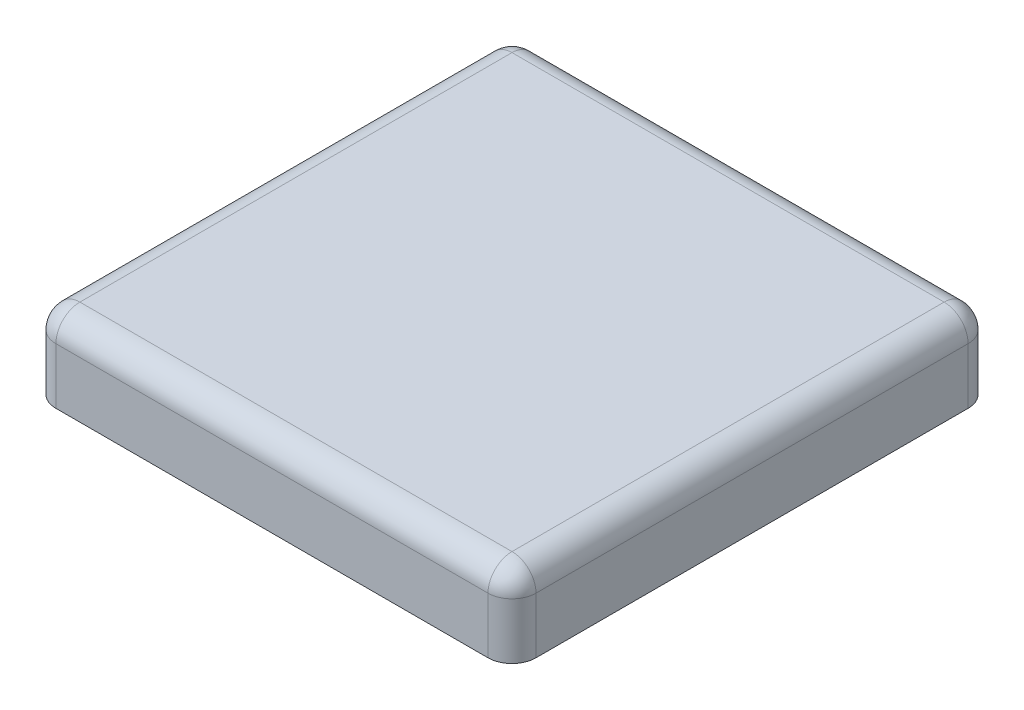
ISO-10303-21;
HEADER;
FILE_DESCRIPTION(('STEP AP214'),'2;1');
FILE_NAME('part.step','',(''),(''),'','','');
FILE_SCHEMA(('AUTOMOTIVE_DESIGN { 1 0 10303 214 1 1 1 1 }'));
ENDSEC;
DATA;
#1=APPLICATION_CONTEXT('core data for automotive mechanical design processes');
#2=APPLICATION_PROTOCOL_DEFINITION('international standard','automotive_design',2000,#1);
#3=PRODUCT_CONTEXT('',#1,'mechanical');
#4=PRODUCT('Part','Part','',(#3));
#5=PRODUCT_RELATED_PRODUCT_CATEGORY('part','',(#4));
#6=PRODUCT_DEFINITION_FORMATION('','',#4);
#7=PRODUCT_DEFINITION_CONTEXT('part definition',#1,'design');
#8=PRODUCT_DEFINITION('design','',#6,#7);
#9=PRODUCT_DEFINITION_SHAPE('','',#8);
#10=(LENGTH_UNIT() NAMED_UNIT(*) SI_UNIT(.MILLI.,.METRE.));
#11=(NAMED_UNIT(*) PLANE_ANGLE_UNIT() SI_UNIT($,.RADIAN.));
#12=(NAMED_UNIT(*) SI_UNIT($,.STERADIAN.) SOLID_ANGLE_UNIT());
#13=UNCERTAINTY_MEASURE_WITH_UNIT(LENGTH_MEASURE(1.E-05),#10,'distance_accuracy_value','');
#14=(GEOMETRIC_REPRESENTATION_CONTEXT(3) GLOBAL_UNCERTAINTY_ASSIGNED_CONTEXT((#13)) GLOBAL_UNIT_ASSIGNED_CONTEXT((#10,
#11,#12)) REPRESENTATION_CONTEXT('',''));
#15=CARTESIAN_POINT('',(0.,0.,0.));
#16=DIRECTION('',(0.,0.,1.));
#17=DIRECTION('',(1.,0.,0.));
#18=AXIS2_PLACEMENT_3D('',#15,#16,#17);
#19=CARTESIAN_POINT('',(0.,171.866203650905,0.));
#20=DIRECTION('',(0.,-1.,0.));
#21=DIRECTION('',(0.,0.,-1.));
#22=AXIS2_PLACEMENT_3D('',#19,#20,#21);
#23=PLANE('',#22);
#24=DIRECTION('',(-1.,0.,0.));
#25=VECTOR('',#24,1.);
#26=CARTESIAN_POINT('',(-15.2400000000001,171.866203650905,-15.24));
#27=LINE('',#26,#25);
#28=CARTESIAN_POINT('',(13.7159999999999,171.866203650905,-15.24));
#29=VERTEX_POINT('',#28);
#30=CARTESIAN_POINT('',(-13.7160000000001,171.866203650905,-15.24));
#31=VERTEX_POINT('',#30);
#32=EDGE_CURVE('E196',#29,#31,#27,.T.);
#33=ORIENTED_EDGE('',*,*,#32,.F.);
#34=CARTESIAN_POINT('',(13.7159999999999,171.866203650905,-13.716));
#35=DIRECTION('',(0.,-1.,0.));
#36=DIRECTION('',(0.,0.,-1.));
#37=AXIS2_PLACEMENT_3D('',#34,#35,#36);
#38=CIRCLE('',#37,1.524);
#39=CARTESIAN_POINT('',(15.2399999999999,171.866203650905,-13.716));
#40=VERTEX_POINT('',#39);
#41=EDGE_CURVE('E11',#29,#40,#38,.T.);
#42=ORIENTED_EDGE('',*,*,#41,.T.);
#43=DIRECTION('',(0.,0.,-1.));
#44=VECTOR('',#43,1.);
#45=CARTESIAN_POINT('',(15.2399999999999,171.866203650905,15.24));
#46=LINE('',#45,#44);
#47=CARTESIAN_POINT('',(15.2399999999999,171.866203650905,13.716));
#48=VERTEX_POINT('',#47);
#49=EDGE_CURVE('E193',#48,#40,#46,.T.);
#50=ORIENTED_EDGE('',*,*,#49,.F.);
#51=CARTESIAN_POINT('',(13.7159999999999,171.866203650905,13.716));
#52=DIRECTION('',(0.,-1.,0.));
#53=DIRECTION('',(0.,0.,-1.));
#54=AXIS2_PLACEMENT_3D('',#51,#52,#53);
#55=CIRCLE('',#54,1.524);
#56=CARTESIAN_POINT('',(13.7159999999999,171.866203650905,15.24));
#57=VERTEX_POINT('',#56);
#58=EDGE_CURVE('E257',#48,#57,#55,.T.);
#59=ORIENTED_EDGE('',*,*,#58,.T.);
#60=DIRECTION('',(1.,0.,0.));
#61=VECTOR('',#60,1.);
#62=CARTESIAN_POINT('',(-15.2400000000001,171.866203650905,15.24));
#63=LINE('',#62,#61);
#64=CARTESIAN_POINT('',(-13.7160000000001,171.866203650905,15.24));
#65=VERTEX_POINT('',#64);
#66=EDGE_CURVE('E204',#65,#57,#63,.T.);
#67=ORIENTED_EDGE('',*,*,#66,.F.);
#68=CARTESIAN_POINT('',(-13.7160000000001,171.866203650905,13.716));
#69=DIRECTION('',(0.,-1.,0.));
#70=DIRECTION('',(0.,0.,-1.));
#71=AXIS2_PLACEMENT_3D('',#68,#69,#70);
#72=CIRCLE('',#71,1.524);
#73=CARTESIAN_POINT('',(-15.2400000000001,171.866203650905,13.716));
#74=VERTEX_POINT('',#73);
#75=EDGE_CURVE('E260',#65,#74,#72,.T.);
#76=ORIENTED_EDGE('',*,*,#75,.T.);
#77=DIRECTION('',(0.,0.,1.));
#78=VECTOR('',#77,1.);
#79=CARTESIAN_POINT('',(-15.2400000000001,171.866203650905,15.24));
#80=LINE('',#79,#78);
#81=CARTESIAN_POINT('',(-15.2400000000001,171.866203650905,-13.716));
#82=VERTEX_POINT('',#81);
#83=EDGE_CURVE('E200',#82,#74,#80,.T.);
#84=ORIENTED_EDGE('',*,*,#83,.F.);
#85=CARTESIAN_POINT('',(-13.7160000000001,171.866203650905,-13.716));
#86=DIRECTION('',(0.,-1.,0.));
#87=DIRECTION('',(0.,0.,-1.));
#88=AXIS2_PLACEMENT_3D('',#85,#86,#87);
#89=CIRCLE('',#88,1.524);
#90=EDGE_CURVE('E48',#82,#31,#89,.T.);
#91=ORIENTED_EDGE('',*,*,#90,.T.);
#92=EDGE_LOOP('',(#33,#42,#50,#59,#67,#76,#84,#91));
#93=FACE_BOUND('',#92,.T.);
#94=DIRECTION('',(0.,0.,-1.));
#95=VECTOR('',#94,1.);
#96=CARTESIAN_POINT('',(13.7159999999999,171.866203650905,0.));
#97=LINE('',#96,#95);
#98=CARTESIAN_POINT('',(13.7159999999999,171.866203650905,13.716));
#99=VERTEX_POINT('',#98);
#100=CARTESIAN_POINT('',(13.7159999999999,171.866203650905,-13.716));
#101=VERTEX_POINT('',#100);
#102=EDGE_CURVE('E182',#99,#101,#97,.T.);
#103=ORIENTED_EDGE('',*,*,#102,.T.);
#104=DIRECTION('',(-1.,0.,0.));
#105=VECTOR('',#104,1.);
#106=CARTESIAN_POINT('',(0.,171.866203650905,-13.716));
#107=LINE('',#106,#105);
#108=CARTESIAN_POINT('',(-13.7160000000001,171.866203650905,-13.716));
#109=VERTEX_POINT('',#108);
#110=EDGE_CURVE('E149',#101,#109,#107,.T.);
#111=ORIENTED_EDGE('',*,*,#110,.T.);
#112=DIRECTION('',(0.,0.,1.));
#113=VECTOR('',#112,1.);
#114=CARTESIAN_POINT('',(-13.7160000000001,171.866203650905,0.));
#115=LINE('',#114,#113);
#116=CARTESIAN_POINT('',(-13.7160000000001,171.866203650905,13.716));
#117=VERTEX_POINT('',#116);
#118=EDGE_CURVE('E187',#109,#117,#115,.T.);
#119=ORIENTED_EDGE('',*,*,#118,.T.);
#120=DIRECTION('',(1.,0.,0.));
#121=VECTOR('',#120,1.);
#122=CARTESIAN_POINT('',(0.,171.866203650905,13.716));
#123=LINE('',#122,#121);
#124=EDGE_CURVE('E56',#117,#99,#123,.T.);
#125=ORIENTED_EDGE('',*,*,#124,.T.);
#126=EDGE_LOOP('',(#103,#111,#119,#125));
#127=FACE_BOUND('',#126,.T.);
#128=ADVANCED_FACE('F38',(#93,#127),#23,.T.);
#129=CARTESIAN_POINT('',(15.2399999999999,176.946203650905,15.24));
#130=DIRECTION('',(-1.,0.,0.));
#131=DIRECTION('',(0.,0.,1.));
#132=AXIS2_PLACEMENT_3D('',#129,#130,#131);
#133=PLANE('',#132);
#134=ORIENTED_EDGE('',*,*,#49,.T.);
#135=DIRECTION('',(0.,-1.,0.));
#136=VECTOR('',#135,1.);
#137=CARTESIAN_POINT('',(15.2399999999999,176.946203650905,-13.716));
#138=LINE('',#137,#136);
#139=CARTESIAN_POINT('',(15.2399999999999,175.422203650905,-13.716));
#140=VERTEX_POINT('',#139);
#141=EDGE_CURVE('E64',#40,#140,#138,.F.);
#142=ORIENTED_EDGE('',*,*,#141,.T.);
#143=DIRECTION('',(0.,0.,-1.));
#144=VECTOR('',#143,1.);
#145=CARTESIAN_POINT('',(15.2399999999999,175.422203650905,15.24));
#146=LINE('',#145,#144);
#147=CARTESIAN_POINT('',(15.2399999999999,175.422203650905,13.716));
#148=VERTEX_POINT('',#147);
#149=EDGE_CURVE('E252',#140,#148,#146,.F.);
#150=ORIENTED_EDGE('',*,*,#149,.T.);
#151=DIRECTION('',(0.,-1.,0.));
#152=VECTOR('',#151,1.);
#153=CARTESIAN_POINT('',(15.2399999999999,176.946203650905,13.716));
#154=LINE('',#153,#152);
#155=EDGE_CURVE('E249',#148,#48,#154,.T.);
#156=ORIENTED_EDGE('',*,*,#155,.T.);
#157=EDGE_LOOP('',(#134,#142,#150,#156));
#158=FACE_BOUND('',#157,.T.);
#159=ADVANCED_FACE('F343',(#158),#133,.F.);
#160=CARTESIAN_POINT('',(-15.2400000000001,176.946203650905,-15.24));
#161=DIRECTION('',(0.,0.,1.));
#162=DIRECTION('',(1.,0.,0.));
#163=AXIS2_PLACEMENT_3D('',#160,#161,#162);
#164=PLANE('',#163);
#165=DIRECTION('',(-1.,0.,0.));
#166=VECTOR('',#165,1.);
#167=CARTESIAN_POINT('',(-15.2400000000001,175.422203650905,-15.24));
#168=LINE('',#167,#166);
#169=CARTESIAN_POINT('',(-13.7160000000001,175.422203650905,-15.24));
#170=VERTEX_POINT('',#169);
#171=CARTESIAN_POINT('',(13.7159999999999,175.422203650905,-15.24));
#172=VERTEX_POINT('',#171);
#173=EDGE_CURVE('E243',#170,#172,#168,.F.);
#174=ORIENTED_EDGE('',*,*,#173,.T.);
#175=DIRECTION('',(0.,-1.,0.));
#176=VECTOR('',#175,1.);
#177=CARTESIAN_POINT('',(13.7159999999999,176.946203650905,-15.24));
#178=LINE('',#177,#176);
#179=EDGE_CURVE('E246',#172,#29,#178,.T.);
#180=ORIENTED_EDGE('',*,*,#179,.T.);
#181=ORIENTED_EDGE('',*,*,#32,.T.);
#182=DIRECTION('',(0.,-1.,0.));
#183=VECTOR('',#182,1.);
#184=CARTESIAN_POINT('',(-13.7160000000001,176.946203650905,-15.24));
#185=LINE('',#184,#183);
#186=EDGE_CURVE('E240',#31,#170,#185,.F.);
#187=ORIENTED_EDGE('',*,*,#186,.T.);
#188=EDGE_LOOP('',(#174,#180,#181,#187));
#189=FACE_BOUND('',#188,.T.);
#190=ADVANCED_FACE('F333',(#189),#164,.F.);
#191=CARTESIAN_POINT('',(-15.2400000000001,176.946203650905,15.24));
#192=DIRECTION('',(1.,0.,0.));
#193=DIRECTION('',(0.,0.,-1.));
#194=AXIS2_PLACEMENT_3D('',#191,#192,#193);
#195=PLANE('',#194);
#196=DIRECTION('',(0.,0.,1.));
#197=VECTOR('',#196,1.);
#198=CARTESIAN_POINT('',(-15.2400000000001,175.422203650905,15.24));
#199=LINE('',#198,#197);
#200=CARTESIAN_POINT('',(-15.2400000000001,175.422203650905,13.716));
#201=VERTEX_POINT('',#200);
#202=CARTESIAN_POINT('',(-15.2400000000001,175.422203650905,-13.716));
#203=VERTEX_POINT('',#202);
#204=EDGE_CURVE('E234',#201,#203,#199,.F.);
#205=ORIENTED_EDGE('',*,*,#204,.T.);
#206=DIRECTION('',(0.,-1.,0.));
#207=VECTOR('',#206,1.);
#208=CARTESIAN_POINT('',(-15.2400000000001,176.946203650905,-13.716));
#209=LINE('',#208,#207);
#210=EDGE_CURVE('E237',#203,#82,#209,.T.);
#211=ORIENTED_EDGE('',*,*,#210,.T.);
#212=ORIENTED_EDGE('',*,*,#83,.T.);
#213=DIRECTION('',(0.,-1.,0.));
#214=VECTOR('',#213,1.);
#215=CARTESIAN_POINT('',(-15.2400000000001,176.946203650905,13.716));
#216=LINE('',#215,#214);
#217=EDGE_CURVE('E231',#74,#201,#216,.F.);
#218=ORIENTED_EDGE('',*,*,#217,.T.);
#219=EDGE_LOOP('',(#205,#211,#212,#218));
#220=FACE_BOUND('',#219,.T.);
#221=ADVANCED_FACE('F369',(#220),#195,.F.);
#222=CARTESIAN_POINT('',(-15.2400000000001,176.946203650905,15.24));
#223=DIRECTION('',(0.,0.,-1.));
#224=DIRECTION('',(-1.,0.,0.));
#225=AXIS2_PLACEMENT_3D('',#222,#223,#224);
#226=PLANE('',#225);
#227=DIRECTION('',(1.,0.,0.));
#228=VECTOR('',#227,1.);
#229=CARTESIAN_POINT('',(-15.2400000000001,175.422203650905,15.24));
#230=LINE('',#229,#228);
#231=CARTESIAN_POINT('',(13.7159999999999,175.422203650905,15.24));
#232=VERTEX_POINT('',#231);
#233=CARTESIAN_POINT('',(-13.7160000000001,175.422203650905,15.24));
#234=VERTEX_POINT('',#233);
#235=EDGE_CURVE('E224',#232,#234,#230,.F.);
#236=ORIENTED_EDGE('',*,*,#235,.T.);
#237=DIRECTION('',(0.,-1.,0.));
#238=VECTOR('',#237,1.);
#239=CARTESIAN_POINT('',(-13.7160000000001,176.946203650905,15.24));
#240=LINE('',#239,#238);
#241=EDGE_CURVE('E228',#234,#65,#240,.T.);
#242=ORIENTED_EDGE('',*,*,#241,.T.);
#243=ORIENTED_EDGE('',*,*,#66,.T.);
#244=DIRECTION('',(0.,-1.,0.));
#245=VECTOR('',#244,1.);
#246=CARTESIAN_POINT('',(13.7159999999999,176.946203650905,15.24));
#247=LINE('',#246,#245);
#248=EDGE_CURVE('E221',#57,#232,#247,.F.);
#249=ORIENTED_EDGE('',*,*,#248,.T.);
#250=EDGE_LOOP('',(#236,#242,#243,#249));
#251=FACE_BOUND('',#250,.T.);
#252=ADVANCED_FACE('F360',(#251),#226,.F.);
#253=CARTESIAN_POINT('',(0.,176.946203650905,0.));
#254=DIRECTION('',(0.,-1.,0.));
#255=DIRECTION('',(0.,0.,-1.));
#256=AXIS2_PLACEMENT_3D('',#253,#254,#255);
#257=PLANE('',#256);
#258=DIRECTION('',(0.,0.,1.));
#259=VECTOR('',#258,1.);
#260=CARTESIAN_POINT('',(-13.7160000000001,176.946203650905,0.));
#261=LINE('',#260,#259);
#262=CARTESIAN_POINT('',(-13.7160000000001,176.946203650905,-13.716));
#263=VERTEX_POINT('',#262);
#264=CARTESIAN_POINT('',(-13.7160000000001,176.946203650905,13.716));
#265=VERTEX_POINT('',#264);
#266=EDGE_CURVE('E214',#263,#265,#261,.T.);
#267=ORIENTED_EDGE('',*,*,#266,.T.);
#268=DIRECTION('',(1.,0.,0.));
#269=VECTOR('',#268,1.);
#270=CARTESIAN_POINT('',(0.,176.946203650905,13.716));
#271=LINE('',#270,#269);
#272=CARTESIAN_POINT('',(13.7159999999999,176.946203650905,13.716));
#273=VERTEX_POINT('',#272);
#274=EDGE_CURVE('E217',#265,#273,#271,.T.);
#275=ORIENTED_EDGE('',*,*,#274,.T.);
#276=DIRECTION('',(0.,0.,-1.));
#277=VECTOR('',#276,1.);
#278=CARTESIAN_POINT('',(13.7159999999999,176.946203650905,0.));
#279=LINE('',#278,#277);
#280=CARTESIAN_POINT('',(13.7159999999999,176.946203650905,-13.716));
#281=VERTEX_POINT('',#280);
#282=EDGE_CURVE('E208',#273,#281,#279,.T.);
#283=ORIENTED_EDGE('',*,*,#282,.T.);
#284=DIRECTION('',(-1.,0.,0.));
#285=VECTOR('',#284,1.);
#286=CARTESIAN_POINT('',(0.,176.946203650905,-13.716));
#287=LINE('',#286,#285);
#288=EDGE_CURVE('E211',#281,#263,#287,.T.);
#289=ORIENTED_EDGE('',*,*,#288,.T.);
#290=EDGE_LOOP('',(#267,#275,#283,#289));
#291=FACE_BOUND('',#290,.T.);
#292=ADVANCED_FACE('F323',(#291),#257,.F.);
#293=CARTESIAN_POINT('',(-13.7160000000001,176.946203650905,-13.716));
#294=DIRECTION('',(0.,-1.,0.));
#295=DIRECTION('',(0.,0.,-1.));
#296=AXIS2_PLACEMENT_3D('',#293,#294,#295);
#297=CYLINDRICAL_SURFACE('',#296,1.524);
#298=ORIENTED_EDGE('',*,*,#90,.F.);
#299=ORIENTED_EDGE('',*,*,#210,.F.);
#300=CARTESIAN_POINT('',(-13.7160000000001,175.422203650905,-13.716));
#301=DIRECTION('',(0.,1.,0.));
#302=DIRECTION('',(0.,0.,1.));
#303=AXIS2_PLACEMENT_3D('',#300,#301,#302);
#304=CIRCLE('',#303,1.524);
#305=EDGE_CURVE('E42',#170,#203,#304,.T.);
#306=ORIENTED_EDGE('',*,*,#305,.F.);
#307=ORIENTED_EDGE('',*,*,#186,.F.);
#308=EDGE_LOOP('',(#298,#299,#306,#307));
#309=FACE_BOUND('',#308,.T.);
#310=ADVANCED_FACE('F40',(#309),#297,.T.);
#311=CARTESIAN_POINT('',(0.,175.422203650905,-13.716));
#312=DIRECTION('',(-1.,0.,0.));
#313=DIRECTION('',(0.,0.,1.));
#314=AXIS2_PLACEMENT_3D('',#311,#312,#313);
#315=CYLINDRICAL_SURFACE('',#314,1.524);
#316=CARTESIAN_POINT('',(13.7159999999999,175.422203650905,-13.716));
#317=DIRECTION('',(1.,0.,0.));
#318=DIRECTION('',(0.,0.,-1.));
#319=AXIS2_PLACEMENT_3D('',#316,#317,#318);
#320=CIRCLE('',#319,1.524);
#321=EDGE_CURVE('E299',#172,#281,#320,.T.);
#322=ORIENTED_EDGE('',*,*,#321,.F.);
#323=ORIENTED_EDGE('',*,*,#173,.F.);
#324=CARTESIAN_POINT('',(-13.7160000000001,175.422203650905,-13.716));
#325=DIRECTION('',(-1.,0.,0.));
#326=DIRECTION('',(0.,0.,1.));
#327=AXIS2_PLACEMENT_3D('',#324,#325,#326);
#328=CIRCLE('',#327,1.524);
#329=EDGE_CURVE('E302',#263,#170,#328,.T.);
#330=ORIENTED_EDGE('',*,*,#329,.F.);
#331=ORIENTED_EDGE('',*,*,#288,.F.);
#332=EDGE_LOOP('',(#322,#323,#330,#331));
#333=FACE_BOUND('',#332,.T.);
#334=ADVANCED_FACE('F330',(#333),#315,.T.);
#335=CARTESIAN_POINT('',(13.7159999999999,176.946203650905,-13.716));
#336=DIRECTION('',(0.,-1.,0.));
#337=DIRECTION('',(0.,0.,-1.));
#338=AXIS2_PLACEMENT_3D('',#335,#336,#337);
#339=CYLINDRICAL_SURFACE('',#338,1.524);
#340=ORIENTED_EDGE('',*,*,#41,.F.);
#341=ORIENTED_EDGE('',*,*,#179,.F.);
#342=CARTESIAN_POINT('',(13.7159999999999,175.422203650905,-13.716));
#343=DIRECTION('',(0.,1.,0.));
#344=DIRECTION('',(0.,0.,1.));
#345=AXIS2_PLACEMENT_3D('',#342,#343,#344);
#346=CIRCLE('',#345,1.524);
#347=EDGE_CURVE('E295',#140,#172,#346,.T.);
#348=ORIENTED_EDGE('',*,*,#347,.F.);
#349=ORIENTED_EDGE('',*,*,#141,.F.);
#350=EDGE_LOOP('',(#340,#341,#348,#349));
#351=FACE_BOUND('',#350,.T.);
#352=ADVANCED_FACE('F337',(#351),#339,.T.);
#353=CARTESIAN_POINT('',(-13.7160000000001,175.422203650905,-13.716));
#354=DIRECTION('',(0.,0.,1.));
#355=DIRECTION('',(1.,0.,0.));
#356=AXIS2_PLACEMENT_3D('',#353,#354,#355);
#357=SPHERICAL_SURFACE('',#356,1.524);
#358=ORIENTED_EDGE('',*,*,#329,.T.);
#359=ORIENTED_EDGE('',*,*,#305,.T.);
#360=CARTESIAN_POINT('',(-13.7160000000001,175.422203650905,-13.716));
#361=DIRECTION('',(0.,0.,-1.));
#362=DIRECTION('',(-1.,0.,0.));
#363=AXIS2_PLACEMENT_3D('',#360,#361,#362);
#364=CIRCLE('',#363,1.524);
#365=EDGE_CURVE('E291',#263,#203,#364,.F.);
#366=ORIENTED_EDGE('',*,*,#365,.F.);
#367=EDGE_LOOP('',(#358,#359,#366));
#368=FACE_BOUND('',#367,.T.);
#369=ADVANCED_FACE('F311',(#368),#357,.T.);
#370=CARTESIAN_POINT('',(13.7159999999999,175.422203650905,-13.716));
#371=DIRECTION('',(0.,0.,1.));
#372=DIRECTION('',(1.,0.,0.));
#373=AXIS2_PLACEMENT_3D('',#370,#371,#372);
#374=SPHERICAL_SURFACE('',#373,1.524);
#375=ORIENTED_EDGE('',*,*,#347,.T.);
#376=ORIENTED_EDGE('',*,*,#321,.T.);
#377=CARTESIAN_POINT('',(13.7159999999999,175.422203650905,-13.716));
#378=DIRECTION('',(0.,0.,-1.));
#379=DIRECTION('',(-1.,0.,0.));
#380=AXIS2_PLACEMENT_3D('',#377,#378,#379);
#381=CIRCLE('',#380,1.524);
#382=EDGE_CURVE('E287',#140,#281,#381,.F.);
#383=ORIENTED_EDGE('',*,*,#382,.F.);
#384=EDGE_LOOP('',(#375,#376,#383));
#385=FACE_BOUND('',#384,.T.);
#386=ADVANCED_FACE('F407',(#385),#374,.T.);
#387=CARTESIAN_POINT('',(-13.7160000000001,176.946203650905,13.716));
#388=DIRECTION('',(0.,-1.,0.));
#389=DIRECTION('',(0.,0.,-1.));
#390=AXIS2_PLACEMENT_3D('',#387,#388,#389);
#391=CYLINDRICAL_SURFACE('',#390,1.524);
#392=ORIENTED_EDGE('',*,*,#75,.F.);
#393=ORIENTED_EDGE('',*,*,#241,.F.);
#394=CARTESIAN_POINT('',(-13.7160000000001,175.422203650905,13.716));
#395=DIRECTION('',(0.,1.,0.));
#396=DIRECTION('',(0.,0.,1.));
#397=AXIS2_PLACEMENT_3D('',#394,#395,#396);
#398=CIRCLE('',#397,1.524);
#399=EDGE_CURVE('E283',#201,#234,#398,.T.);
#400=ORIENTED_EDGE('',*,*,#399,.F.);
#401=ORIENTED_EDGE('',*,*,#217,.F.);
#402=EDGE_LOOP('',(#392,#393,#400,#401));
#403=FACE_BOUND('',#402,.T.);
#404=ADVANCED_FACE('F367',(#403),#391,.T.);
#405=CARTESIAN_POINT('',(-13.7160000000001,175.422203650905,0.));
#406=DIRECTION('',(0.,0.,1.));
#407=DIRECTION('',(1.,0.,0.));
#408=AXIS2_PLACEMENT_3D('',#405,#406,#407);
#409=CYLINDRICAL_SURFACE('',#408,1.524);
#410=ORIENTED_EDGE('',*,*,#365,.T.);
#411=ORIENTED_EDGE('',*,*,#204,.F.);
#412=CARTESIAN_POINT('',(-13.7160000000001,175.422203650905,13.716));
#413=DIRECTION('',(0.,0.,1.));
#414=DIRECTION('',(1.,0.,0.));
#415=AXIS2_PLACEMENT_3D('',#412,#413,#414);
#416=CIRCLE('',#415,1.524);
#417=EDGE_CURVE('E279',#265,#201,#416,.T.);
#418=ORIENTED_EDGE('',*,*,#417,.F.);
#419=ORIENTED_EDGE('',*,*,#266,.F.);
#420=EDGE_LOOP('',(#410,#411,#418,#419));
#421=FACE_BOUND('',#420,.T.);
#422=ADVANCED_FACE('F318',(#421),#409,.T.);
#423=CARTESIAN_POINT('',(13.7159999999999,175.422203650905,0.));
#424=DIRECTION('',(0.,0.,-1.));
#425=DIRECTION('',(-1.,0.,0.));
#426=AXIS2_PLACEMENT_3D('',#423,#424,#425);
#427=CYLINDRICAL_SURFACE('',#426,1.524);
#428=ORIENTED_EDGE('',*,*,#382,.T.);
#429=ORIENTED_EDGE('',*,*,#282,.F.);
#430=CARTESIAN_POINT('',(13.7159999999999,175.422203650905,13.716));
#431=DIRECTION('',(0.,0.,1.));
#432=DIRECTION('',(1.,0.,0.));
#433=AXIS2_PLACEMENT_3D('',#430,#431,#432);
#434=CIRCLE('',#433,1.524);
#435=EDGE_CURVE('E275',#148,#273,#434,.T.);
#436=ORIENTED_EDGE('',*,*,#435,.F.);
#437=ORIENTED_EDGE('',*,*,#149,.F.);
#438=EDGE_LOOP('',(#428,#429,#436,#437));
#439=FACE_BOUND('',#438,.T.);
#440=ADVANCED_FACE('F353',(#439),#427,.T.);
#441=CARTESIAN_POINT('',(13.7159999999999,176.946203650905,13.716));
#442=DIRECTION('',(0.,-1.,0.));
#443=DIRECTION('',(0.,0.,-1.));
#444=AXIS2_PLACEMENT_3D('',#441,#442,#443);
#445=CYLINDRICAL_SURFACE('',#444,1.524);
#446=ORIENTED_EDGE('',*,*,#58,.F.);
#447=ORIENTED_EDGE('',*,*,#155,.F.);
#448=CARTESIAN_POINT('',(13.7159999999999,175.422203650905,13.716));
#449=DIRECTION('',(0.,1.,0.));
#450=DIRECTION('',(0.,0.,1.));
#451=AXIS2_PLACEMENT_3D('',#448,#449,#450);
#452=CIRCLE('',#451,1.524);
#453=EDGE_CURVE('E271',#232,#148,#452,.T.);
#454=ORIENTED_EDGE('',*,*,#453,.F.);
#455=ORIENTED_EDGE('',*,*,#248,.F.);
#456=EDGE_LOOP('',(#446,#447,#454,#455));
#457=FACE_BOUND('',#456,.T.);
#458=ADVANCED_FACE('F349',(#457),#445,.T.);
#459=CARTESIAN_POINT('',(-13.7160000000001,175.422203650905,13.716));
#460=DIRECTION('',(0.,0.,1.));
#461=DIRECTION('',(1.,0.,0.));
#462=AXIS2_PLACEMENT_3D('',#459,#460,#461);
#463=SPHERICAL_SURFACE('',#462,1.524);
#464=ORIENTED_EDGE('',*,*,#417,.T.);
#465=ORIENTED_EDGE('',*,*,#399,.T.);
#466=CARTESIAN_POINT('',(-13.7160000000001,175.422203650905,13.716));
#467=DIRECTION('',(-1.,0.,0.));
#468=DIRECTION('',(0.,0.,1.));
#469=AXIS2_PLACEMENT_3D('',#466,#467,#468);
#470=CIRCLE('',#469,1.524);
#471=EDGE_CURVE('E268',#265,#234,#470,.F.);
#472=ORIENTED_EDGE('',*,*,#471,.F.);
#473=EDGE_LOOP('',(#464,#465,#472));
#474=FACE_BOUND('',#473,.T.);
#475=ADVANCED_FACE('F395',(#474),#463,.T.);
#476=CARTESIAN_POINT('',(13.7159999999999,175.422203650905,13.716));
#477=DIRECTION('',(0.,0.,1.));
#478=DIRECTION('',(1.,0.,0.));
#479=AXIS2_PLACEMENT_3D('',#476,#477,#478);
#480=SPHERICAL_SURFACE('',#479,1.524);
#481=ORIENTED_EDGE('',*,*,#453,.T.);
#482=ORIENTED_EDGE('',*,*,#435,.T.);
#483=CARTESIAN_POINT('',(13.7159999999999,175.422203650905,13.716));
#484=DIRECTION('',(1.,0.,0.));
#485=DIRECTION('',(0.,0.,-1.));
#486=AXIS2_PLACEMENT_3D('',#483,#484,#485);
#487=CIRCLE('',#486,1.524);
#488=EDGE_CURVE('E265',#232,#273,#487,.F.);
#489=ORIENTED_EDGE('',*,*,#488,.F.);
#490=EDGE_LOOP('',(#481,#482,#489));
#491=FACE_BOUND('',#490,.T.);
#492=ADVANCED_FACE('F356',(#491),#480,.T.);
#493=CARTESIAN_POINT('',(0.,175.422203650905,13.716));
#494=DIRECTION('',(1.,0.,0.));
#495=DIRECTION('',(0.,0.,-1.));
#496=AXIS2_PLACEMENT_3D('',#493,#494,#495);
#497=CYLINDRICAL_SURFACE('',#496,1.524);
#498=ORIENTED_EDGE('',*,*,#471,.T.);
#499=ORIENTED_EDGE('',*,*,#235,.F.);
#500=ORIENTED_EDGE('',*,*,#488,.T.);
#501=ORIENTED_EDGE('',*,*,#274,.F.);
#502=EDGE_LOOP('',(#498,#499,#500,#501));
#503=FACE_BOUND('',#502,.T.);
#504=ADVANCED_FACE('F358',(#503),#497,.T.);
#505=CARTESIAN_POINT('',(13.7159999999999,176.946203650905,15.24));
#506=DIRECTION('',(-1.,0.,0.));
#507=DIRECTION('',(0.,0.,1.));
#508=AXIS2_PLACEMENT_3D('',#505,#506,#507);
#509=PLANE('',#508);
#510=ORIENTED_EDGE('',*,*,#102,.F.);
#511=DIRECTION('',(0.,-1.,0.));
#512=VECTOR('',#511,1.);
#513=CARTESIAN_POINT('',(13.7159999999999,176.946203650905,13.716));
#514=LINE('',#513,#512);
#515=CARTESIAN_POINT('',(13.7159999999999,175.422203650905,13.716));
#516=VERTEX_POINT('',#515);
#517=EDGE_CURVE('E154',#516,#99,#514,.T.);
#518=ORIENTED_EDGE('',*,*,#517,.F.);
#519=DIRECTION('',(0.,0.,-1.));
#520=VECTOR('',#519,1.);
#521=CARTESIAN_POINT('',(13.7159999999999,175.422203650905,0.));
#522=LINE('',#521,#520);
#523=CARTESIAN_POINT('',(13.7159999999999,175.422203650905,-13.716));
#524=VERTEX_POINT('',#523);
#525=EDGE_CURVE('E157',#516,#524,#522,.T.);
#526=ORIENTED_EDGE('',*,*,#525,.T.);
#527=DIRECTION('',(0.,-1.,0.));
#528=VECTOR('',#527,1.);
#529=CARTESIAN_POINT('',(13.7159999999999,176.946203650905,-13.716));
#530=LINE('',#529,#528);
#531=EDGE_CURVE('E142',#524,#101,#530,.T.);
#532=ORIENTED_EDGE('',*,*,#531,.T.);
#533=EDGE_LOOP('',(#510,#518,#526,#532));
#534=FACE_BOUND('',#533,.T.);
#535=ADVANCED_FACE('F158',(#534),#509,.T.);
#536=CARTESIAN_POINT('',(-15.2400000000001,176.946203650905,-13.716));
#537=DIRECTION('',(0.,0.,1.));
#538=DIRECTION('',(1.,0.,0.));
#539=AXIS2_PLACEMENT_3D('',#536,#537,#538);
#540=PLANE('',#539);
#541=DIRECTION('',(1.,0.,0.));
#542=VECTOR('',#541,1.);
#543=CARTESIAN_POINT('',(-15.2400000000001,175.422203650905,-13.716));
#544=LINE('',#543,#542);
#545=CARTESIAN_POINT('',(-13.7160000000001,175.422203650905,-13.716));
#546=VERTEX_POINT('',#545);
#547=EDGE_CURVE('E146',#546,#524,#544,.T.);
#548=ORIENTED_EDGE('',*,*,#547,.F.);
#549=DIRECTION('',(0.,-1.,0.));
#550=VECTOR('',#549,1.);
#551=CARTESIAN_POINT('',(-13.7160000000001,176.946203650905,-13.716));
#552=LINE('',#551,#550);
#553=EDGE_CURVE('E169',#546,#109,#552,.T.);
#554=ORIENTED_EDGE('',*,*,#553,.T.);
#555=ORIENTED_EDGE('',*,*,#110,.F.);
#556=ORIENTED_EDGE('',*,*,#531,.F.);
#557=EDGE_LOOP('',(#548,#554,#555,#556));
#558=FACE_BOUND('',#557,.T.);
#559=ADVANCED_FACE('F144',(#558),#540,.T.);
#560=CARTESIAN_POINT('',(-13.7160000000001,176.946203650905,15.24));
#561=DIRECTION('',(1.,0.,0.));
#562=DIRECTION('',(0.,0.,-1.));
#563=AXIS2_PLACEMENT_3D('',#560,#561,#562);
#564=PLANE('',#563);
#565=DIRECTION('',(0.,0.,-1.));
#566=VECTOR('',#565,1.);
#567=CARTESIAN_POINT('',(-13.7160000000001,175.422203650905,15.24));
#568=LINE('',#567,#566);
#569=CARTESIAN_POINT('',(-13.7160000000001,175.422203650905,13.716));
#570=VERTEX_POINT('',#569);
#571=EDGE_CURVE('E166',#570,#546,#568,.T.);
#572=ORIENTED_EDGE('',*,*,#571,.F.);
#573=DIRECTION('',(0.,-1.,0.));
#574=VECTOR('',#573,1.);
#575=CARTESIAN_POINT('',(-13.7160000000001,176.946203650905,13.716));
#576=LINE('',#575,#574);
#577=EDGE_CURVE('E177',#570,#117,#576,.T.);
#578=ORIENTED_EDGE('',*,*,#577,.T.);
#579=ORIENTED_EDGE('',*,*,#118,.F.);
#580=ORIENTED_EDGE('',*,*,#553,.F.);
#581=EDGE_LOOP('',(#572,#578,#579,#580));
#582=FACE_BOUND('',#581,.T.);
#583=ADVANCED_FACE('F466',(#582),#564,.T.);
#584=CARTESIAN_POINT('',(-15.2400000000001,176.946203650905,13.716));
#585=DIRECTION('',(0.,0.,-1.));
#586=DIRECTION('',(-1.,0.,0.));
#587=AXIS2_PLACEMENT_3D('',#584,#585,#586);
#588=PLANE('',#587);
#589=DIRECTION('',(-1.,0.,0.));
#590=VECTOR('',#589,1.);
#591=CARTESIAN_POINT('',(-15.2400000000001,175.422203650905,13.716));
#592=LINE('',#591,#590);
#593=EDGE_CURVE('E163',#516,#570,#592,.T.);
#594=ORIENTED_EDGE('',*,*,#593,.F.);
#595=ORIENTED_EDGE('',*,*,#517,.T.);
#596=ORIENTED_EDGE('',*,*,#124,.F.);
#597=ORIENTED_EDGE('',*,*,#577,.F.);
#598=EDGE_LOOP('',(#594,#595,#596,#597));
#599=FACE_BOUND('',#598,.T.);
#600=ADVANCED_FACE('F473',(#599),#588,.T.);
#601=CARTESIAN_POINT('',(0.,175.422203650905,0.));
#602=DIRECTION('',(0.,-1.,0.));
#603=DIRECTION('',(0.,0.,-1.));
#604=AXIS2_PLACEMENT_3D('',#601,#602,#603);
#605=PLANE('',#604);
#606=ORIENTED_EDGE('',*,*,#571,.T.);
#607=ORIENTED_EDGE('',*,*,#547,.T.);
#608=ORIENTED_EDGE('',*,*,#525,.F.);
#609=ORIENTED_EDGE('',*,*,#593,.T.);
#610=EDGE_LOOP('',(#606,#607,#608,#609));
#611=FACE_BOUND('',#610,.T.);
#612=ADVANCED_FACE('F165',(#611),#605,.T.);
#613=CLOSED_SHELL('',(#128,#159,#190,#221,#252,#292,#310,#334,#352,#369,#386,#404,#422,#440,
#458,#475,#492,#504,#535,#559,#583,#600,#612));
#614=MANIFOLD_SOLID_BREP('B2',#613);
#615=ADVANCED_BREP_SHAPE_REPRESENTATION('',(#18,#614),#14);
#616=SHAPE_DEFINITION_REPRESENTATION(#9,#615);
ENDSEC;
END-ISO-10303-21;
